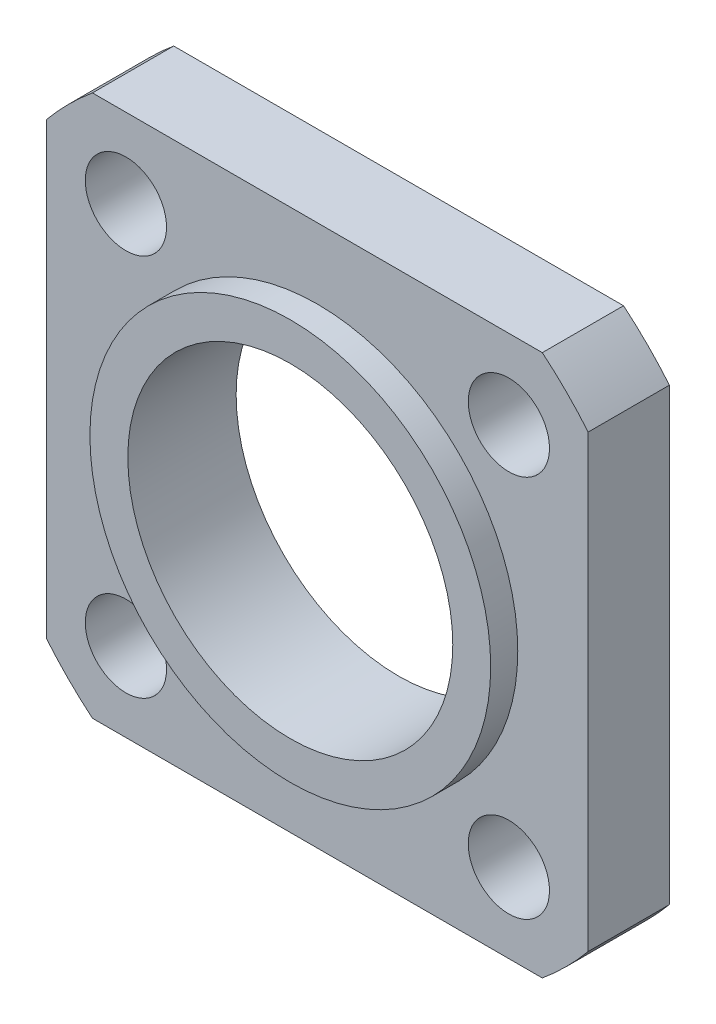
ISO-10303-21;
HEADER;
FILE_DESCRIPTION(('STEP AP214'),'2;1');
FILE_NAME('part.step','',(''),(''),'','','');
FILE_SCHEMA(('AUTOMOTIVE_DESIGN { 1 0 10303 214 1 1 1 1 }'));
ENDSEC;
DATA;
#1=APPLICATION_CONTEXT('core data for automotive mechanical design processes');
#2=APPLICATION_PROTOCOL_DEFINITION('international standard','automotive_design',2000,#1);
#3=PRODUCT_CONTEXT('',#1,'mechanical');
#4=PRODUCT('Part','Part','',(#3));
#5=PRODUCT_RELATED_PRODUCT_CATEGORY('part','',(#4));
#6=PRODUCT_DEFINITION_FORMATION('','',#4);
#7=PRODUCT_DEFINITION_CONTEXT('part definition',#1,'design');
#8=PRODUCT_DEFINITION('design','',#6,#7);
#9=PRODUCT_DEFINITION_SHAPE('','',#8);
#10=(LENGTH_UNIT() NAMED_UNIT(*) SI_UNIT(.MILLI.,.METRE.));
#11=(NAMED_UNIT(*) PLANE_ANGLE_UNIT() SI_UNIT($,.RADIAN.));
#12=(NAMED_UNIT(*) SI_UNIT($,.STERADIAN.) SOLID_ANGLE_UNIT());
#13=UNCERTAINTY_MEASURE_WITH_UNIT(LENGTH_MEASURE(1.E-05),#10,'distance_accuracy_value','');
#14=(GEOMETRIC_REPRESENTATION_CONTEXT(3) GLOBAL_UNCERTAINTY_ASSIGNED_CONTEXT((#13)) GLOBAL_UNIT_ASSIGNED_CONTEXT((#10,
#11,#12)) REPRESENTATION_CONTEXT('',''));
#15=CARTESIAN_POINT('',(0.,0.,0.));
#16=DIRECTION('',(0.,0.,1.));
#17=DIRECTION('',(1.,0.,0.));
#18=AXIS2_PLACEMENT_3D('',#15,#16,#17);
#19=CARTESIAN_POINT('',(0.,0.,3.));
#20=DIRECTION('',(0.,0.,-1.));
#21=DIRECTION('',(-1.,0.,0.));
#22=AXIS2_PLACEMENT_3D('',#19,#20,#21);
#23=CYLINDRICAL_SURFACE('',#22,13.);
#24=CARTESIAN_POINT('',(0.,0.,3.));
#25=DIRECTION('',(0.,0.,1.));
#26=DIRECTION('',(1.,0.,0.));
#27=AXIS2_PLACEMENT_3D('',#24,#25,#26);
#28=CIRCLE('',#27,13.);
#29=CARTESIAN_POINT('',(-8.30662386291807,10.,3.));
#30=VERTEX_POINT('',#29);
#31=CARTESIAN_POINT('',(-10.,8.30662386291808,3.));
#32=VERTEX_POINT('',#31);
#33=EDGE_CURVE('E118',#30,#32,#28,.T.);
#34=ORIENTED_EDGE('',*,*,#33,.F.);
#35=DIRECTION('',(0.,0.,-1.));
#36=VECTOR('',#35,1.);
#37=CARTESIAN_POINT('',(-8.30662386291808,10.,3.));
#38=LINE('',#37,#36);
#39=CARTESIAN_POINT('',(-8.30662386291807,10.,0.));
#40=VERTEX_POINT('',#39);
#41=EDGE_CURVE('E11',#30,#40,#38,.T.);
#42=ORIENTED_EDGE('',*,*,#41,.T.);
#43=CARTESIAN_POINT('',(0.,0.,0.));
#44=DIRECTION('',(0.,0.,1.));
#45=DIRECTION('',(1.,0.,0.));
#46=AXIS2_PLACEMENT_3D('',#43,#44,#45);
#47=CIRCLE('',#46,13.);
#48=CARTESIAN_POINT('',(-10.,8.30662386291808,0.));
#49=VERTEX_POINT('',#48);
#50=EDGE_CURVE('E141',#40,#49,#47,.T.);
#51=ORIENTED_EDGE('',*,*,#50,.T.);
#52=DIRECTION('',(0.,0.,-1.));
#53=VECTOR('',#52,1.);
#54=CARTESIAN_POINT('',(-10.,8.30662386291808,3.));
#55=LINE('',#54,#53);
#56=EDGE_CURVE('E125',#49,#32,#55,.F.);
#57=ORIENTED_EDGE('',*,*,#56,.T.);
#58=EDGE_LOOP('',(#34,#42,#51,#57));
#59=FACE_BOUND('',#58,.T.);
#60=ADVANCED_FACE('F38',(#59),#23,.T.);
#61=CARTESIAN_POINT('',(10.,8.30662386291807,0.));
#62=VERTEX_POINT('',#61);
#63=CARTESIAN_POINT('',(8.30662386291807,10.,0.));
#64=VERTEX_POINT('',#63);
#65=EDGE_CURVE('E137',#62,#64,#47,.T.);
#66=ORIENTED_EDGE('',*,*,#65,.T.);
#67=DIRECTION('',(0.,0.,-1.));
#68=VECTOR('',#67,1.);
#69=CARTESIAN_POINT('',(8.30662386291808,10.,3.));
#70=LINE('',#69,#68);
#71=CARTESIAN_POINT('',(8.30662386291807,10.,3.));
#72=VERTEX_POINT('',#71);
#73=EDGE_CURVE('E47',#64,#72,#70,.F.);
#74=ORIENTED_EDGE('',*,*,#73,.T.);
#75=CARTESIAN_POINT('',(10.,8.30662386291807,3.));
#76=VERTEX_POINT('',#75);
#77=EDGE_CURVE('E120',#76,#72,#28,.T.);
#78=ORIENTED_EDGE('',*,*,#77,.F.);
#79=DIRECTION('',(0.,0.,-1.));
#80=VECTOR('',#79,1.);
#81=CARTESIAN_POINT('',(10.,8.30662386291808,3.));
#82=LINE('',#81,#80);
#83=EDGE_CURVE('E159',#76,#62,#82,.T.);
#84=ORIENTED_EDGE('',*,*,#83,.T.);
#85=EDGE_LOOP('',(#66,#74,#78,#84));
#86=FACE_BOUND('',#85,.T.);
#87=ADVANCED_FACE('F164',(#86),#23,.T.);
#88=CARTESIAN_POINT('',(8.30662386291808,-10.,0.));
#89=VERTEX_POINT('',#88);
#90=CARTESIAN_POINT('',(10.,-8.30662386291807,0.));
#91=VERTEX_POINT('',#90);
#92=EDGE_CURVE('E142',#89,#91,#47,.T.);
#93=ORIENTED_EDGE('',*,*,#92,.T.);
#94=DIRECTION('',(0.,0.,-1.));
#95=VECTOR('',#94,1.);
#96=CARTESIAN_POINT('',(10.,-8.30662386291808,3.));
#97=LINE('',#96,#95);
#98=CARTESIAN_POINT('',(10.,-8.30662386291807,3.));
#99=VERTEX_POINT('',#98);
#100=EDGE_CURVE('E156',#91,#99,#97,.F.);
#101=ORIENTED_EDGE('',*,*,#100,.T.);
#102=CARTESIAN_POINT('',(8.30662386291808,-10.,3.));
#103=VERTEX_POINT('',#102);
#104=EDGE_CURVE('E131',#103,#99,#28,.T.);
#105=ORIENTED_EDGE('',*,*,#104,.F.);
#106=DIRECTION('',(0.,0.,-1.));
#107=VECTOR('',#106,1.);
#108=CARTESIAN_POINT('',(8.30662386291808,-10.,3.));
#109=LINE('',#108,#107);
#110=EDGE_CURVE('E152',#103,#89,#109,.T.);
#111=ORIENTED_EDGE('',*,*,#110,.T.);
#112=EDGE_LOOP('',(#93,#101,#105,#111));
#113=FACE_BOUND('',#112,.T.);
#114=ADVANCED_FACE('F245',(#113),#23,.T.);
#115=CARTESIAN_POINT('',(0.,0.,3.));
#116=DIRECTION('',(0.,0.,1.));
#117=DIRECTION('',(1.,0.,0.));
#118=AXIS2_PLACEMENT_3D('',#115,#116,#117);
#119=PLANE('',#118);
#120=DIRECTION('',(1.,0.,0.));
#121=VECTOR('',#120,1.);
#122=CARTESIAN_POINT('',(-8.30662386291807,10.,3.));
#123=LINE('',#122,#121);
#124=EDGE_CURVE('E104',#30,#72,#123,.T.);
#125=ORIENTED_EDGE('',*,*,#124,.F.);
#126=ORIENTED_EDGE('',*,*,#33,.T.);
#127=DIRECTION('',(0.,1.,0.));
#128=VECTOR('',#127,1.);
#129=CARTESIAN_POINT('',(-10.,-8.30662386291808,3.));
#130=LINE('',#129,#128);
#131=CARTESIAN_POINT('',(-10.,-8.30662386291808,3.));
#132=VERTEX_POINT('',#131);
#133=EDGE_CURVE('E382',#132,#32,#130,.T.);
#134=ORIENTED_EDGE('',*,*,#133,.F.);
#135=CARTESIAN_POINT('',(-8.30662386291807,-10.,3.));
#136=VERTEX_POINT('',#135);
#137=EDGE_CURVE('E127',#132,#136,#28,.T.);
#138=ORIENTED_EDGE('',*,*,#137,.T.);
#139=DIRECTION('',(-1.,0.,0.));
#140=VECTOR('',#139,1.);
#141=CARTESIAN_POINT('',(8.30662386291808,-10.,3.));
#142=LINE('',#141,#140);
#143=EDGE_CURVE('E62',#103,#136,#142,.T.);
#144=ORIENTED_EDGE('',*,*,#143,.F.);
#145=ORIENTED_EDGE('',*,*,#104,.T.);
#146=DIRECTION('',(0.,-1.,0.));
#147=VECTOR('',#146,1.);
#148=CARTESIAN_POINT('',(10.,8.30662386291807,3.));
#149=LINE('',#148,#147);
#150=EDGE_CURVE('E54',#76,#99,#149,.T.);
#151=ORIENTED_EDGE('',*,*,#150,.F.);
#152=ORIENTED_EDGE('',*,*,#77,.T.);
#153=EDGE_LOOP('',(#125,#126,#134,#138,#144,#145,#151,#152));
#154=FACE_BOUND('',#153,.T.);
#155=CARTESIAN_POINT('',(-7.07106781186543,-7.07106781186552,3.));
#156=DIRECTION('',(0.,0.,1.));
#157=DIRECTION('',(1.,0.,0.));
#158=AXIS2_PLACEMENT_3D('',#155,#156,#157);
#159=CIRCLE('',#158,1.5);
#160=CARTESIAN_POINT('',(-5.57106781186543,-7.07106781186552,3.));
#161=VERTEX_POINT('',#160);
#162=EDGE_CURVE('E192',#161,#161,#159,.T.);
#163=ORIENTED_EDGE('',*,*,#162,.F.);
#164=EDGE_LOOP('',(#163));
#165=FACE_BOUND('',#164,.T.);
#166=CARTESIAN_POINT('',(7.07106781186543,7.07106781186551,3.));
#167=DIRECTION('',(0.,0.,1.));
#168=DIRECTION('',(1.,0.,0.));
#169=AXIS2_PLACEMENT_3D('',#166,#167,#168);
#170=CIRCLE('',#169,1.5);
#171=CARTESIAN_POINT('',(8.57106781186543,7.07106781186551,3.));
#172=VERTEX_POINT('',#171);
#173=EDGE_CURVE('E208',#172,#172,#170,.T.);
#174=ORIENTED_EDGE('',*,*,#173,.F.);
#175=EDGE_LOOP('',(#174));
#176=FACE_BOUND('',#175,.T.);
#177=CARTESIAN_POINT('',(-7.07106781186551,7.07106781186543,3.));
#178=DIRECTION('',(0.,0.,1.));
#179=DIRECTION('',(1.,0.,0.));
#180=AXIS2_PLACEMENT_3D('',#177,#178,#179);
#181=CIRCLE('',#180,1.5);
#182=CARTESIAN_POINT('',(-5.57106781186551,7.07106781186543,3.));
#183=VERTEX_POINT('',#182);
#184=EDGE_CURVE('E216',#183,#183,#181,.T.);
#185=ORIENTED_EDGE('',*,*,#184,.F.);
#186=EDGE_LOOP('',(#185));
#187=FACE_BOUND('',#186,.T.);
#188=CARTESIAN_POINT('',(7.07106781186552,-7.07106781186543,3.));
#189=DIRECTION('',(0.,0.,1.));
#190=DIRECTION('',(1.,0.,0.));
#191=AXIS2_PLACEMENT_3D('',#188,#189,#190);
#192=CIRCLE('',#191,1.5);
#193=CARTESIAN_POINT('',(8.57106781186551,-7.07106781186543,3.));
#194=VERTEX_POINT('',#193);
#195=EDGE_CURVE('E200',#194,#194,#192,.T.);
#196=ORIENTED_EDGE('',*,*,#195,.F.);
#197=EDGE_LOOP('',(#196));
#198=FACE_BOUND('',#197,.T.);
#199=CARTESIAN_POINT('',(0.,0.,3.));
#200=DIRECTION('',(0.,0.,1.));
#201=DIRECTION('',(1.,0.,0.));
#202=AXIS2_PLACEMENT_3D('',#199,#200,#201);
#203=CIRCLE('',#202,7.4);
#204=CARTESIAN_POINT('',(7.4,0.,3.));
#205=VERTEX_POINT('',#204);
#206=EDGE_CURVE('E178',#205,#205,#203,.T.);
#207=ORIENTED_EDGE('',*,*,#206,.F.);
#208=EDGE_LOOP('',(#207));
#209=FACE_BOUND('',#208,.T.);
#210=ADVANCED_FACE('F115',(#154,#165,#176,#187,#198,#209),#119,.T.);
#211=CARTESIAN_POINT('',(0.,0.,0.));
#212=DIRECTION('',(0.,0.,1.));
#213=DIRECTION('',(1.,0.,0.));
#214=AXIS2_PLACEMENT_3D('',#211,#212,#213);
#215=PLANE('',#214);
#216=ORIENTED_EDGE('',*,*,#50,.F.);
#217=DIRECTION('',(1.,0.,0.));
#218=VECTOR('',#217,1.);
#219=CARTESIAN_POINT('',(0.,10.,0.));
#220=LINE('',#219,#218);
#221=EDGE_CURVE('E107',#40,#64,#220,.T.);
#222=ORIENTED_EDGE('',*,*,#221,.T.);
#223=ORIENTED_EDGE('',*,*,#65,.F.);
#224=DIRECTION('',(0.,-1.,0.));
#225=VECTOR('',#224,1.);
#226=CARTESIAN_POINT('',(10.,0.,0.));
#227=LINE('',#226,#225);
#228=EDGE_CURVE('E173',#62,#91,#227,.T.);
#229=ORIENTED_EDGE('',*,*,#228,.T.);
#230=ORIENTED_EDGE('',*,*,#92,.F.);
#231=DIRECTION('',(-1.,0.,0.));
#232=VECTOR('',#231,1.);
#233=CARTESIAN_POINT('',(0.,-10.,0.));
#234=LINE('',#233,#232);
#235=CARTESIAN_POINT('',(-8.30662386291807,-10.,0.));
#236=VERTEX_POINT('',#235);
#237=EDGE_CURVE('E180',#89,#236,#234,.T.);
#238=ORIENTED_EDGE('',*,*,#237,.T.);
#239=CARTESIAN_POINT('',(-10.,-8.30662386291808,0.));
#240=VERTEX_POINT('',#239);
#241=EDGE_CURVE('E265',#240,#236,#47,.T.);
#242=ORIENTED_EDGE('',*,*,#241,.F.);
#243=DIRECTION('',(0.,1.,0.));
#244=VECTOR('',#243,1.);
#245=CARTESIAN_POINT('',(-10.,0.,0.));
#246=LINE('',#245,#244);
#247=EDGE_CURVE('E122',#240,#49,#246,.T.);
#248=ORIENTED_EDGE('',*,*,#247,.T.);
#249=EDGE_LOOP('',(#216,#222,#223,#229,#230,#238,#242,#248));
#250=FACE_BOUND('',#249,.T.);
#251=CARTESIAN_POINT('',(0.,0.,0.));
#252=DIRECTION('',(0.,0.,1.));
#253=DIRECTION('',(1.,0.,0.));
#254=AXIS2_PLACEMENT_3D('',#251,#252,#253);
#255=CIRCLE('',#254,6.);
#256=CARTESIAN_POINT('',(6.,0.,0.));
#257=VERTEX_POINT('',#256);
#258=EDGE_CURVE('E135',#257,#257,#255,.T.);
#259=ORIENTED_EDGE('',*,*,#258,.T.);
#260=EDGE_LOOP('',(#259));
#261=FACE_BOUND('',#260,.T.);
#262=CARTESIAN_POINT('',(-7.07106781186551,7.07106781186543,0.));
#263=DIRECTION('',(0.,0.,1.));
#264=DIRECTION('',(1.,0.,0.));
#265=AXIS2_PLACEMENT_3D('',#262,#263,#264);
#266=CIRCLE('',#265,1.5);
#267=CARTESIAN_POINT('',(-5.57106781186551,7.07106781186543,0.));
#268=VERTEX_POINT('',#267);
#269=EDGE_CURVE('E212',#268,#268,#266,.T.);
#270=ORIENTED_EDGE('',*,*,#269,.T.);
#271=EDGE_LOOP('',(#270));
#272=FACE_BOUND('',#271,.T.);
#273=CARTESIAN_POINT('',(7.07106781186543,7.07106781186551,0.));
#274=DIRECTION('',(0.,0.,1.));
#275=DIRECTION('',(1.,0.,0.));
#276=AXIS2_PLACEMENT_3D('',#273,#274,#275);
#277=CIRCLE('',#276,1.5);
#278=CARTESIAN_POINT('',(8.57106781186543,7.07106781186551,0.));
#279=VERTEX_POINT('',#278);
#280=EDGE_CURVE('E204',#279,#279,#277,.T.);
#281=ORIENTED_EDGE('',*,*,#280,.T.);
#282=EDGE_LOOP('',(#281));
#283=FACE_BOUND('',#282,.T.);
#284=CARTESIAN_POINT('',(7.07106781186552,-7.07106781186543,0.));
#285=DIRECTION('',(0.,0.,1.));
#286=DIRECTION('',(1.,0.,0.));
#287=AXIS2_PLACEMENT_3D('',#284,#285,#286);
#288=CIRCLE('',#287,1.5);
#289=CARTESIAN_POINT('',(8.57106781186551,-7.07106781186543,0.));
#290=VERTEX_POINT('',#289);
#291=EDGE_CURVE('E196',#290,#290,#288,.T.);
#292=ORIENTED_EDGE('',*,*,#291,.T.);
#293=EDGE_LOOP('',(#292));
#294=FACE_BOUND('',#293,.T.);
#295=CARTESIAN_POINT('',(-7.07106781186543,-7.07106781186552,0.));
#296=DIRECTION('',(0.,0.,1.));
#297=DIRECTION('',(1.,0.,0.));
#298=AXIS2_PLACEMENT_3D('',#295,#296,#297);
#299=CIRCLE('',#298,1.5);
#300=CARTESIAN_POINT('',(-5.57106781186543,-7.07106781186552,0.));
#301=VERTEX_POINT('',#300);
#302=EDGE_CURVE('E188',#301,#301,#299,.T.);
#303=ORIENTED_EDGE('',*,*,#302,.T.);
#304=EDGE_LOOP('',(#303));
#305=FACE_BOUND('',#304,.T.);
#306=ADVANCED_FACE('F167',(#250,#261,#272,#283,#294,#305),#215,.F.);
#307=ORIENTED_EDGE('',*,*,#241,.T.);
#308=DIRECTION('',(0.,0.,-1.));
#309=VECTOR('',#308,1.);
#310=CARTESIAN_POINT('',(-8.30662386291807,-10.,3.));
#311=LINE('',#310,#309);
#312=EDGE_CURVE('E149',#236,#136,#311,.F.);
#313=ORIENTED_EDGE('',*,*,#312,.T.);
#314=ORIENTED_EDGE('',*,*,#137,.F.);
#315=DIRECTION('',(0.,0.,-1.));
#316=VECTOR('',#315,1.);
#317=CARTESIAN_POINT('',(-10.,-8.30662386291808,3.));
#318=LINE('',#317,#316);
#319=EDGE_CURVE('E145',#132,#240,#318,.T.);
#320=ORIENTED_EDGE('',*,*,#319,.T.);
#321=EDGE_LOOP('',(#307,#313,#314,#320));
#322=FACE_BOUND('',#321,.T.);
#323=ADVANCED_FACE('F40',(#322),#23,.T.);
#324=CARTESIAN_POINT('',(0.,0.,3.));
#325=DIRECTION('',(0.,0.,-1.));
#326=DIRECTION('',(-1.,0.,0.));
#327=AXIS2_PLACEMENT_3D('',#324,#325,#326);
#328=CYLINDRICAL_SURFACE('',#327,6.);
#329=ORIENTED_EDGE('',*,*,#258,.F.);
#330=EDGE_LOOP('',(#329));
#331=FACE_BOUND('',#330,.T.);
#332=CARTESIAN_POINT('',(0.,0.,4.));
#333=DIRECTION('',(0.,0.,1.));
#334=DIRECTION('',(1.,0.,0.));
#335=AXIS2_PLACEMENT_3D('',#332,#333,#334);
#336=CIRCLE('',#335,6.);
#337=CARTESIAN_POINT('',(6.,0.,4.));
#338=VERTEX_POINT('',#337);
#339=EDGE_CURVE('E172',#338,#338,#336,.T.);
#340=ORIENTED_EDGE('',*,*,#339,.T.);
#341=EDGE_LOOP('',(#340));
#342=FACE_BOUND('',#341,.T.);
#343=ADVANCED_FACE('F228',(#331,#342),#328,.F.);
#344=CARTESIAN_POINT('',(-7.07106781186551,7.07106781186543,3.));
#345=DIRECTION('',(0.,0.,-1.));
#346=DIRECTION('',(-1.,0.,0.));
#347=AXIS2_PLACEMENT_3D('',#344,#345,#346);
#348=CYLINDRICAL_SURFACE('',#347,1.5);
#349=ORIENTED_EDGE('',*,*,#184,.T.);
#350=EDGE_LOOP('',(#349));
#351=FACE_BOUND('',#350,.T.);
#352=ORIENTED_EDGE('',*,*,#269,.F.);
#353=EDGE_LOOP('',(#352));
#354=FACE_BOUND('',#353,.T.);
#355=ADVANCED_FACE('F225',(#351,#354),#348,.F.);
#356=CARTESIAN_POINT('',(7.07106781186543,7.07106781186551,3.));
#357=DIRECTION('',(0.,0.,-1.));
#358=DIRECTION('',(-1.,0.,0.));
#359=AXIS2_PLACEMENT_3D('',#356,#357,#358);
#360=CYLINDRICAL_SURFACE('',#359,1.5);
#361=ORIENTED_EDGE('',*,*,#173,.T.);
#362=EDGE_LOOP('',(#361));
#363=FACE_BOUND('',#362,.T.);
#364=ORIENTED_EDGE('',*,*,#280,.F.);
#365=EDGE_LOOP('',(#364));
#366=FACE_BOUND('',#365,.T.);
#367=ADVANCED_FACE('F227',(#363,#366),#360,.F.);
#368=CARTESIAN_POINT('',(7.07106781186552,-7.07106781186543,3.));
#369=DIRECTION('',(0.,0.,-1.));
#370=DIRECTION('',(-1.,0.,0.));
#371=AXIS2_PLACEMENT_3D('',#368,#369,#370);
#372=CYLINDRICAL_SURFACE('',#371,1.5);
#373=ORIENTED_EDGE('',*,*,#195,.T.);
#374=EDGE_LOOP('',(#373));
#375=FACE_BOUND('',#374,.T.);
#376=ORIENTED_EDGE('',*,*,#291,.F.);
#377=EDGE_LOOP('',(#376));
#378=FACE_BOUND('',#377,.T.);
#379=ADVANCED_FACE('F235',(#375,#378),#372,.F.);
#380=CARTESIAN_POINT('',(-7.07106781186543,-7.07106781186552,3.));
#381=DIRECTION('',(0.,0.,-1.));
#382=DIRECTION('',(-1.,0.,0.));
#383=AXIS2_PLACEMENT_3D('',#380,#381,#382);
#384=CYLINDRICAL_SURFACE('',#383,1.5);
#385=ORIENTED_EDGE('',*,*,#162,.T.);
#386=EDGE_LOOP('',(#385));
#387=FACE_BOUND('',#386,.T.);
#388=ORIENTED_EDGE('',*,*,#302,.F.);
#389=EDGE_LOOP('',(#388));
#390=FACE_BOUND('',#389,.T.);
#391=ADVANCED_FACE('F276',(#387,#390),#384,.F.);
#392=CARTESIAN_POINT('',(0.,0.,4.));
#393=DIRECTION('',(0.,0.,1.));
#394=DIRECTION('',(1.,0.,0.));
#395=AXIS2_PLACEMENT_3D('',#392,#393,#394);
#396=PLANE('',#395);
#397=CARTESIAN_POINT('',(0.,0.,4.));
#398=DIRECTION('',(0.,0.,1.));
#399=DIRECTION('',(1.,0.,0.));
#400=AXIS2_PLACEMENT_3D('',#397,#398,#399);
#401=CIRCLE('',#400,7.4);
#402=CARTESIAN_POINT('',(7.4,0.,4.));
#403=VERTEX_POINT('',#402);
#404=EDGE_CURVE('E184',#403,#403,#401,.T.);
#405=ORIENTED_EDGE('',*,*,#404,.T.);
#406=EDGE_LOOP('',(#405));
#407=FACE_BOUND('',#406,.T.);
#408=ORIENTED_EDGE('',*,*,#339,.F.);
#409=EDGE_LOOP('',(#408));
#410=FACE_BOUND('',#409,.T.);
#411=ADVANCED_FACE('F273',(#407,#410),#396,.T.);
#412=CARTESIAN_POINT('',(0.,0.,4.));
#413=DIRECTION('',(0.,0.,-1.));
#414=DIRECTION('',(-1.,0.,0.));
#415=AXIS2_PLACEMENT_3D('',#412,#413,#414);
#416=CYLINDRICAL_SURFACE('',#415,7.4);
#417=ORIENTED_EDGE('',*,*,#404,.F.);
#418=EDGE_LOOP('',(#417));
#419=FACE_BOUND('',#418,.T.);
#420=ORIENTED_EDGE('',*,*,#206,.T.);
#421=EDGE_LOOP('',(#420));
#422=FACE_BOUND('',#421,.T.);
#423=ADVANCED_FACE('F275',(#419,#422),#416,.T.);
#424=CARTESIAN_POINT('',(-10.,-8.30662386291808,-38.));
#425=DIRECTION('',(1.,0.,0.));
#426=DIRECTION('',(0.,0.,-1.));
#427=AXIS2_PLACEMENT_3D('',#424,#425,#426);
#428=PLANE('',#427);
#429=ORIENTED_EDGE('',*,*,#319,.F.);
#430=ORIENTED_EDGE('',*,*,#133,.T.);
#431=ORIENTED_EDGE('',*,*,#56,.F.);
#432=ORIENTED_EDGE('',*,*,#247,.F.);
#433=EDGE_LOOP('',(#429,#430,#431,#432));
#434=FACE_BOUND('',#433,.T.);
#435=ADVANCED_FACE('F283',(#434),#428,.F.);
#436=CARTESIAN_POINT('',(8.30662386291808,-10.,-38.));
#437=DIRECTION('',(0.,1.,0.));
#438=DIRECTION('',(-1.,0.,0.));
#439=AXIS2_PLACEMENT_3D('',#436,#437,#438);
#440=PLANE('',#439);
#441=ORIENTED_EDGE('',*,*,#110,.F.);
#442=ORIENTED_EDGE('',*,*,#143,.T.);
#443=ORIENTED_EDGE('',*,*,#312,.F.);
#444=ORIENTED_EDGE('',*,*,#237,.F.);
#445=EDGE_LOOP('',(#441,#442,#443,#444));
#446=FACE_BOUND('',#445,.T.);
#447=ADVANCED_FACE('F351',(#446),#440,.F.);
#448=CARTESIAN_POINT('',(10.,8.30662386291807,-38.));
#449=DIRECTION('',(-1.,0.,0.));
#450=DIRECTION('',(0.,0.,1.));
#451=AXIS2_PLACEMENT_3D('',#448,#449,#450);
#452=PLANE('',#451);
#453=ORIENTED_EDGE('',*,*,#83,.F.);
#454=ORIENTED_EDGE('',*,*,#150,.T.);
#455=ORIENTED_EDGE('',*,*,#100,.F.);
#456=ORIENTED_EDGE('',*,*,#228,.F.);
#457=EDGE_LOOP('',(#453,#454,#455,#456));
#458=FACE_BOUND('',#457,.T.);
#459=ADVANCED_FACE('F357',(#458),#452,.F.);
#460=CARTESIAN_POINT('',(-8.30662386291807,10.,-38.));
#461=DIRECTION('',(0.,-1.,0.));
#462=DIRECTION('',(0.,0.,-1.));
#463=AXIS2_PLACEMENT_3D('',#460,#461,#462);
#464=PLANE('',#463);
#465=ORIENTED_EDGE('',*,*,#41,.F.);
#466=ORIENTED_EDGE('',*,*,#124,.T.);
#467=ORIENTED_EDGE('',*,*,#73,.F.);
#468=ORIENTED_EDGE('',*,*,#221,.F.);
#469=EDGE_LOOP('',(#465,#466,#467,#468));
#470=FACE_BOUND('',#469,.T.);
#471=ADVANCED_FACE('F103',(#470),#464,.F.);
#472=CLOSED_SHELL('',(#60,#87,#114,#210,#306,#323,#343,#355,#367,#379,#391,#411,#423,#435,#447,
#459,#471));
#473=MANIFOLD_SOLID_BREP('B2',#472);
#474=ADVANCED_BREP_SHAPE_REPRESENTATION('',(#18,#473),#14);
#475=SHAPE_DEFINITION_REPRESENTATION(#9,#474);
ENDSEC;
END-ISO-10303-21;
